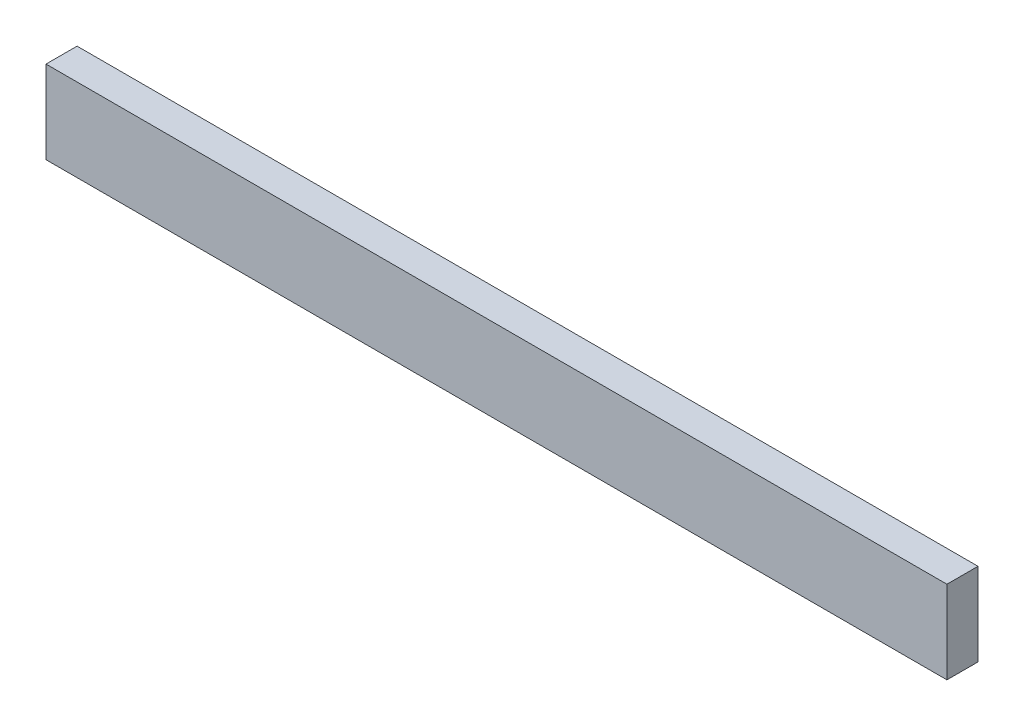
ISO-10303-21;
HEADER;
FILE_DESCRIPTION(('STEP AP214'),'2;1');
FILE_NAME('part.step','',(''),(''),'','','');
FILE_SCHEMA(('AUTOMOTIVE_DESIGN { 1 0 10303 214 1 1 1 1 }'));
ENDSEC;
DATA;
#1=APPLICATION_CONTEXT('core data for automotive mechanical design processes');
#2=APPLICATION_PROTOCOL_DEFINITION('international standard','automotive_design',2000,#1);
#3=PRODUCT_CONTEXT('',#1,'mechanical');
#4=PRODUCT('Part','Part','',(#3));
#5=PRODUCT_RELATED_PRODUCT_CATEGORY('part','',(#4));
#6=PRODUCT_DEFINITION_FORMATION('','',#4);
#7=PRODUCT_DEFINITION_CONTEXT('part definition',#1,'design');
#8=PRODUCT_DEFINITION('design','',#6,#7);
#9=PRODUCT_DEFINITION_SHAPE('','',#8);
#10=(LENGTH_UNIT() NAMED_UNIT(*) SI_UNIT(.MILLI.,.METRE.));
#11=(NAMED_UNIT(*) PLANE_ANGLE_UNIT() SI_UNIT($,.RADIAN.));
#12=(NAMED_UNIT(*) SI_UNIT($,.STERADIAN.) SOLID_ANGLE_UNIT());
#13=UNCERTAINTY_MEASURE_WITH_UNIT(LENGTH_MEASURE(1.E-05),#10,'distance_accuracy_value','');
#14=(GEOMETRIC_REPRESENTATION_CONTEXT(3) GLOBAL_UNCERTAINTY_ASSIGNED_CONTEXT((#13)) GLOBAL_UNIT_ASSIGNED_CONTEXT((#10,
#11,#12)) REPRESENTATION_CONTEXT('',''));
#15=CARTESIAN_POINT('',(0.,0.,0.));
#16=DIRECTION('',(0.,0.,1.));
#17=DIRECTION('',(1.,0.,0.));
#18=AXIS2_PLACEMENT_3D('',#15,#16,#17);
#19=CARTESIAN_POINT('',(0.,0.,19.05));
#20=DIRECTION('',(1.,0.,0.));
#21=DIRECTION('',(0.,0.,-1.));
#22=AXIS2_PLACEMENT_3D('',#19,#20,#21);
#23=PLANE('',#22);
#24=DIRECTION('',(0.,-1.,0.));
#25=VECTOR('',#24,1.);
#26=CARTESIAN_POINT('',(0.,0.,0.));
#27=LINE('',#26,#25);
#28=CARTESIAN_POINT('',(0.,50.8,0.));
#29=VERTEX_POINT('',#28);
#30=CARTESIAN_POINT('',(0.,0.,0.));
#31=VERTEX_POINT('',#30);
#32=EDGE_CURVE('E107',#29,#31,#27,.T.);
#33=ORIENTED_EDGE('',*,*,#32,.T.);
#34=DIRECTION('',(0.,0.,-1.));
#35=VECTOR('',#34,1.);
#36=CARTESIAN_POINT('',(0.,0.,19.05));
#37=LINE('',#36,#35);
#38=CARTESIAN_POINT('',(0.,0.,19.05));
#39=VERTEX_POINT('',#38);
#40=EDGE_CURVE('E11',#39,#31,#37,.T.);
#41=ORIENTED_EDGE('',*,*,#40,.F.);
#42=DIRECTION('',(0.,-1.,0.));
#43=VECTOR('',#42,1.);
#44=CARTESIAN_POINT('',(0.,0.,19.05));
#45=LINE('',#44,#43);
#46=CARTESIAN_POINT('',(0.,50.8,19.05));
#47=VERTEX_POINT('',#46);
#48=EDGE_CURVE('E91',#47,#39,#45,.T.);
#49=ORIENTED_EDGE('',*,*,#48,.F.);
#50=DIRECTION('',(0.,0.,-1.));
#51=VECTOR('',#50,1.);
#52=CARTESIAN_POINT('',(0.,50.8,19.05));
#53=LINE('',#52,#51);
#54=EDGE_CURVE('E103',#47,#29,#53,.T.);
#55=ORIENTED_EDGE('',*,*,#54,.T.);
#56=EDGE_LOOP('',(#33,#41,#49,#55));
#57=FACE_BOUND('',#56,.T.);
#58=ADVANCED_FACE('F39',(#57),#23,.F.);
#59=CARTESIAN_POINT('',(0.,0.,19.05));
#60=DIRECTION('',(0.,1.,0.));
#61=DIRECTION('',(0.,0.,1.));
#62=AXIS2_PLACEMENT_3D('',#59,#60,#61);
#63=PLANE('',#62);
#64=DIRECTION('',(1.,0.,0.));
#65=VECTOR('',#64,1.);
#66=CARTESIAN_POINT('',(0.,0.,0.));
#67=LINE('',#66,#65);
#68=CARTESIAN_POINT('',(552.45,0.,0.));
#69=VERTEX_POINT('',#68);
#70=EDGE_CURVE('E96',#31,#69,#67,.T.);
#71=ORIENTED_EDGE('',*,*,#70,.T.);
#72=DIRECTION('',(0.,0.,-1.));
#73=VECTOR('',#72,1.);
#74=CARTESIAN_POINT('',(552.45,0.,19.05));
#75=LINE('',#74,#73);
#76=CARTESIAN_POINT('',(552.45,0.,19.05));
#77=VERTEX_POINT('',#76);
#78=EDGE_CURVE('E48',#77,#69,#75,.T.);
#79=ORIENTED_EDGE('',*,*,#78,.F.);
#80=DIRECTION('',(1.,0.,0.));
#81=VECTOR('',#80,1.);
#82=CARTESIAN_POINT('',(0.,0.,19.05));
#83=LINE('',#82,#81);
#84=EDGE_CURVE('E86',#39,#77,#83,.T.);
#85=ORIENTED_EDGE('',*,*,#84,.F.);
#86=ORIENTED_EDGE('',*,*,#40,.T.);
#87=EDGE_LOOP('',(#71,#79,#85,#86));
#88=FACE_BOUND('',#87,.T.);
#89=ADVANCED_FACE('F95',(#88),#63,.F.);
#90=CARTESIAN_POINT('',(552.45,0.,19.05));
#91=DIRECTION('',(-1.,0.,0.));
#92=DIRECTION('',(0.,0.,1.));
#93=AXIS2_PLACEMENT_3D('',#90,#91,#92);
#94=PLANE('',#93);
#95=DIRECTION('',(0.,1.,0.));
#96=VECTOR('',#95,1.);
#97=CARTESIAN_POINT('',(552.45,0.,0.));
#98=LINE('',#97,#96);
#99=CARTESIAN_POINT('',(552.45,50.8,0.));
#100=VERTEX_POINT('',#99);
#101=EDGE_CURVE('E73',#69,#100,#98,.T.);
#102=ORIENTED_EDGE('',*,*,#101,.T.);
#103=DIRECTION('',(0.,0.,-1.));
#104=VECTOR('',#103,1.);
#105=CARTESIAN_POINT('',(552.45,50.8,19.05));
#106=LINE('',#105,#104);
#107=CARTESIAN_POINT('',(552.45,50.8,19.05));
#108=VERTEX_POINT('',#107);
#109=EDGE_CURVE('E98',#108,#100,#106,.T.);
#110=ORIENTED_EDGE('',*,*,#109,.F.);
#111=DIRECTION('',(0.,1.,0.));
#112=VECTOR('',#111,1.);
#113=CARTESIAN_POINT('',(552.45,0.,19.05));
#114=LINE('',#113,#112);
#115=EDGE_CURVE('E89',#77,#108,#114,.T.);
#116=ORIENTED_EDGE('',*,*,#115,.F.);
#117=ORIENTED_EDGE('',*,*,#78,.T.);
#118=EDGE_LOOP('',(#102,#110,#116,#117));
#119=FACE_BOUND('',#118,.T.);
#120=ADVANCED_FACE('F99',(#119),#94,.F.);
#121=CARTESIAN_POINT('',(0.,50.8,19.05));
#122=DIRECTION('',(0.,-1.,0.));
#123=DIRECTION('',(0.,0.,-1.));
#124=AXIS2_PLACEMENT_3D('',#121,#122,#123);
#125=PLANE('',#124);
#126=DIRECTION('',(-1.,0.,0.));
#127=VECTOR('',#126,1.);
#128=CARTESIAN_POINT('',(0.,50.8,0.));
#129=LINE('',#128,#127);
#130=EDGE_CURVE('E79',#100,#29,#129,.T.);
#131=ORIENTED_EDGE('',*,*,#130,.T.);
#132=ORIENTED_EDGE('',*,*,#54,.F.);
#133=DIRECTION('',(-1.,0.,0.));
#134=VECTOR('',#133,1.);
#135=CARTESIAN_POINT('',(0.,50.8,19.05));
#136=LINE('',#135,#134);
#137=EDGE_CURVE('E56',#108,#47,#136,.T.);
#138=ORIENTED_EDGE('',*,*,#137,.F.);
#139=ORIENTED_EDGE('',*,*,#109,.T.);
#140=EDGE_LOOP('',(#131,#132,#138,#139));
#141=FACE_BOUND('',#140,.T.);
#142=ADVANCED_FACE('F120',(#141),#125,.F.);
#143=CARTESIAN_POINT('',(0.,0.,19.05));
#144=DIRECTION('',(0.,0.,-1.));
#145=DIRECTION('',(-1.,0.,0.));
#146=AXIS2_PLACEMENT_3D('',#143,#144,#145);
#147=PLANE('',#146);
#148=ORIENTED_EDGE('',*,*,#48,.T.);
#149=ORIENTED_EDGE('',*,*,#84,.T.);
#150=ORIENTED_EDGE('',*,*,#115,.T.);
#151=ORIENTED_EDGE('',*,*,#137,.T.);
#152=EDGE_LOOP('',(#148,#149,#150,#151));
#153=FACE_BOUND('',#152,.T.);
#154=ADVANCED_FACE('F87',(#153),#147,.F.);
#155=CARTESIAN_POINT('',(0.,0.,0.));
#156=DIRECTION('',(0.,0.,-1.));
#157=DIRECTION('',(-1.,0.,0.));
#158=AXIS2_PLACEMENT_3D('',#155,#156,#157);
#159=PLANE('',#158);
#160=ORIENTED_EDGE('',*,*,#32,.F.);
#161=ORIENTED_EDGE('',*,*,#130,.F.);
#162=ORIENTED_EDGE('',*,*,#101,.F.);
#163=ORIENTED_EDGE('',*,*,#70,.F.);
#164=EDGE_LOOP('',(#160,#161,#162,#163));
#165=FACE_BOUND('',#164,.T.);
#166=ADVANCED_FACE('F123',(#165),#159,.T.);
#167=CLOSED_SHELL('',(#58,#89,#120,#142,#154,#166));
#168=MANIFOLD_SOLID_BREP('B2',#167);
#169=ADVANCED_BREP_SHAPE_REPRESENTATION('',(#18,#168),#14);
#170=SHAPE_DEFINITION_REPRESENTATION(#9,#169);
ENDSEC;
END-ISO-10303-21;
